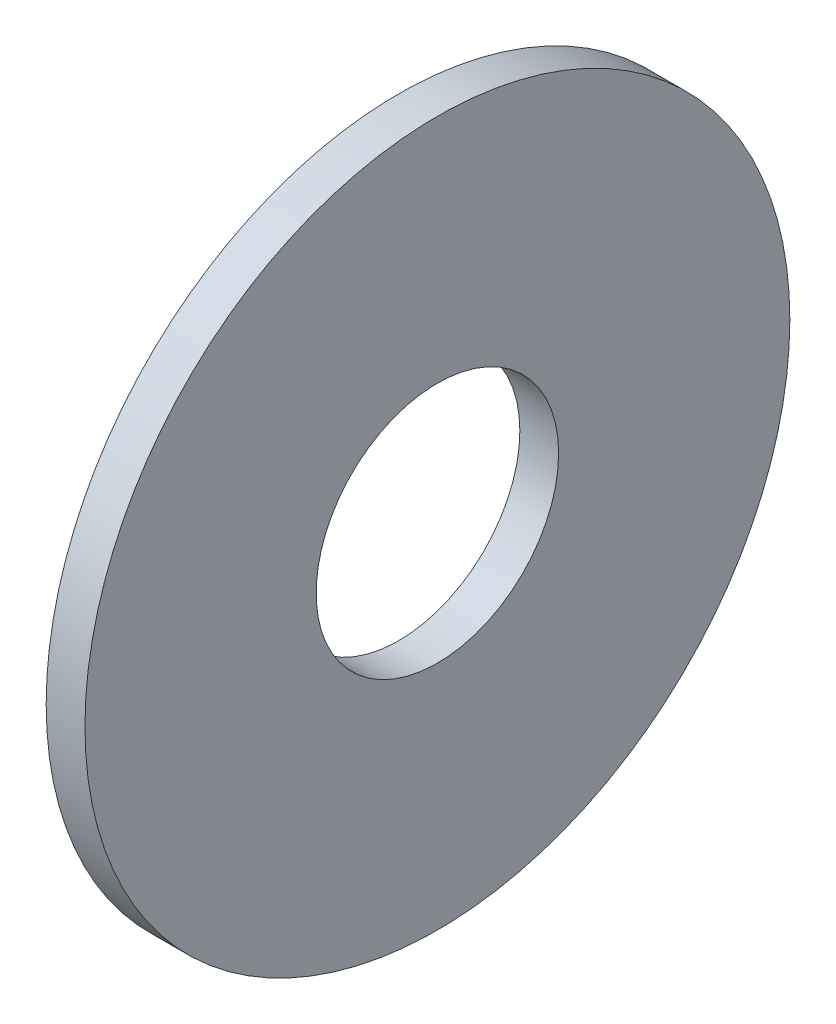
ISO-10303-21;
HEADER;
FILE_DESCRIPTION(('STEP AP214'),'2;1');
FILE_NAME('part.step','',(''),(''),'','','');
FILE_SCHEMA(('AUTOMOTIVE_DESIGN { 1 0 10303 214 1 1 1 1 }'));
ENDSEC;
DATA;
#1=APPLICATION_CONTEXT('core data for automotive mechanical design processes');
#2=APPLICATION_PROTOCOL_DEFINITION('international standard','automotive_design',2000,#1);
#3=PRODUCT_CONTEXT('',#1,'mechanical');
#4=PRODUCT('Part','Part','',(#3));
#5=PRODUCT_RELATED_PRODUCT_CATEGORY('part','',(#4));
#6=PRODUCT_DEFINITION_FORMATION('','',#4);
#7=PRODUCT_DEFINITION_CONTEXT('part definition',#1,'design');
#8=PRODUCT_DEFINITION('design','',#6,#7);
#9=PRODUCT_DEFINITION_SHAPE('','',#8);
#10=(LENGTH_UNIT() NAMED_UNIT(*) SI_UNIT(.MILLI.,.METRE.));
#11=(NAMED_UNIT(*) PLANE_ANGLE_UNIT() SI_UNIT($,.RADIAN.));
#12=(NAMED_UNIT(*) SI_UNIT($,.STERADIAN.) SOLID_ANGLE_UNIT());
#13=UNCERTAINTY_MEASURE_WITH_UNIT(LENGTH_MEASURE(1.E-05),#10,'distance_accuracy_value','');
#14=(GEOMETRIC_REPRESENTATION_CONTEXT(3) GLOBAL_UNCERTAINTY_ASSIGNED_CONTEXT((#13)) GLOBAL_UNIT_ASSIGNED_CONTEXT((#10,
#11,#12)) REPRESENTATION_CONTEXT('',''));
#15=CARTESIAN_POINT('',(0.,0.,0.));
#16=DIRECTION('',(0.,0.,1.));
#17=DIRECTION('',(1.,0.,0.));
#18=AXIS2_PLACEMENT_3D('',#15,#16,#17);
#19=CARTESIAN_POINT('',(1.397,0.,0.));
#20=DIRECTION('',(1.,0.,0.));
#21=DIRECTION('',(0.,0.,-1.));
#22=AXIS2_PLACEMENT_3D('',#19,#20,#21);
#23=PLANE('',#22);
#24=CARTESIAN_POINT('',(1.397,0.,0.));
#25=DIRECTION('',(1.,0.,0.));
#26=DIRECTION('',(0.,0.,-1.));
#27=AXIS2_PLACEMENT_3D('',#24,#25,#26);
#28=CIRCLE('',#27,12.7);
#29=CARTESIAN_POINT('',(1.397,0.,-12.7));
#30=VERTEX_POINT('',#29);
#31=EDGE_CURVE('E10',#30,#30,#28,.T.);
#32=ORIENTED_EDGE('',*,*,#31,.T.);
#33=EDGE_LOOP('',(#32));
#34=FACE_BOUND('',#33,.T.);
#35=CARTESIAN_POINT('',(1.397,0.,0.));
#36=DIRECTION('',(1.,0.,0.));
#37=DIRECTION('',(0.,0.,-1.));
#38=AXIS2_PLACEMENT_3D('',#35,#36,#37);
#39=CIRCLE('',#38,4.3688);
#40=CARTESIAN_POINT('',(1.397,0.,-4.3688));
#41=VERTEX_POINT('',#40);
#42=EDGE_CURVE('E41',#41,#41,#39,.T.);
#43=ORIENTED_EDGE('',*,*,#42,.F.);
#44=EDGE_LOOP('',(#43));
#45=FACE_BOUND('',#44,.T.);
#46=ADVANCED_FACE('F30',(#34,#45),#23,.T.);
#47=CARTESIAN_POINT('',(0.,0.,0.));
#48=DIRECTION('',(1.,0.,0.));
#49=DIRECTION('',(0.,0.,-1.));
#50=AXIS2_PLACEMENT_3D('',#47,#48,#49);
#51=PLANE('',#50);
#52=CARTESIAN_POINT('',(0.,0.,0.));
#53=DIRECTION('',(1.,0.,0.));
#54=DIRECTION('',(0.,0.,-1.));
#55=AXIS2_PLACEMENT_3D('',#52,#53,#54);
#56=CIRCLE('',#55,12.7);
#57=CARTESIAN_POINT('',(0.,0.,-12.7));
#58=VERTEX_POINT('',#57);
#59=EDGE_CURVE('E34',#58,#58,#56,.T.);
#60=ORIENTED_EDGE('',*,*,#59,.F.);
#61=EDGE_LOOP('',(#60));
#62=FACE_BOUND('',#61,.T.);
#63=CARTESIAN_POINT('',(0.,0.,0.));
#64=DIRECTION('',(1.,0.,0.));
#65=DIRECTION('',(0.,0.,-1.));
#66=AXIS2_PLACEMENT_3D('',#63,#64,#65);
#67=CIRCLE('',#66,4.3688);
#68=CARTESIAN_POINT('',(0.,0.,-4.3688));
#69=VERTEX_POINT('',#68);
#70=EDGE_CURVE('E43',#69,#69,#67,.T.);
#71=ORIENTED_EDGE('',*,*,#70,.T.);
#72=EDGE_LOOP('',(#71));
#73=FACE_BOUND('',#72,.T.);
#74=ADVANCED_FACE('F53',(#62,#73),#51,.F.);
#75=CARTESIAN_POINT('',(1.397,0.,0.));
#76=DIRECTION('',(-1.,0.,0.));
#77=DIRECTION('',(0.,0.,1.));
#78=AXIS2_PLACEMENT_3D('',#75,#76,#77);
#79=CYLINDRICAL_SURFACE('',#78,12.7);
#80=ORIENTED_EDGE('',*,*,#31,.F.);
#81=EDGE_LOOP('',(#80));
#82=FACE_BOUND('',#81,.T.);
#83=ORIENTED_EDGE('',*,*,#59,.T.);
#84=EDGE_LOOP('',(#83));
#85=FACE_BOUND('',#84,.T.);
#86=ADVANCED_FACE('F32',(#82,#85),#79,.T.);
#87=CARTESIAN_POINT('',(1.397,0.,0.));
#88=DIRECTION('',(-1.,0.,0.));
#89=DIRECTION('',(0.,0.,1.));
#90=AXIS2_PLACEMENT_3D('',#87,#88,#89);
#91=CYLINDRICAL_SURFACE('',#90,4.3688);
#92=ORIENTED_EDGE('',*,*,#42,.T.);
#93=EDGE_LOOP('',(#92));
#94=FACE_BOUND('',#93,.T.);
#95=ORIENTED_EDGE('',*,*,#70,.F.);
#96=EDGE_LOOP('',(#95));
#97=FACE_BOUND('',#96,.T.);
#98=ADVANCED_FACE('F49',(#94,#97),#91,.F.);
#99=CLOSED_SHELL('',(#46,#74,#86,#98));
#100=MANIFOLD_SOLID_BREP('B2',#99);
#101=ADVANCED_BREP_SHAPE_REPRESENTATION('',(#18,#100),#14);
#102=SHAPE_DEFINITION_REPRESENTATION(#9,#101);
ENDSEC;
END-ISO-10303-21;
